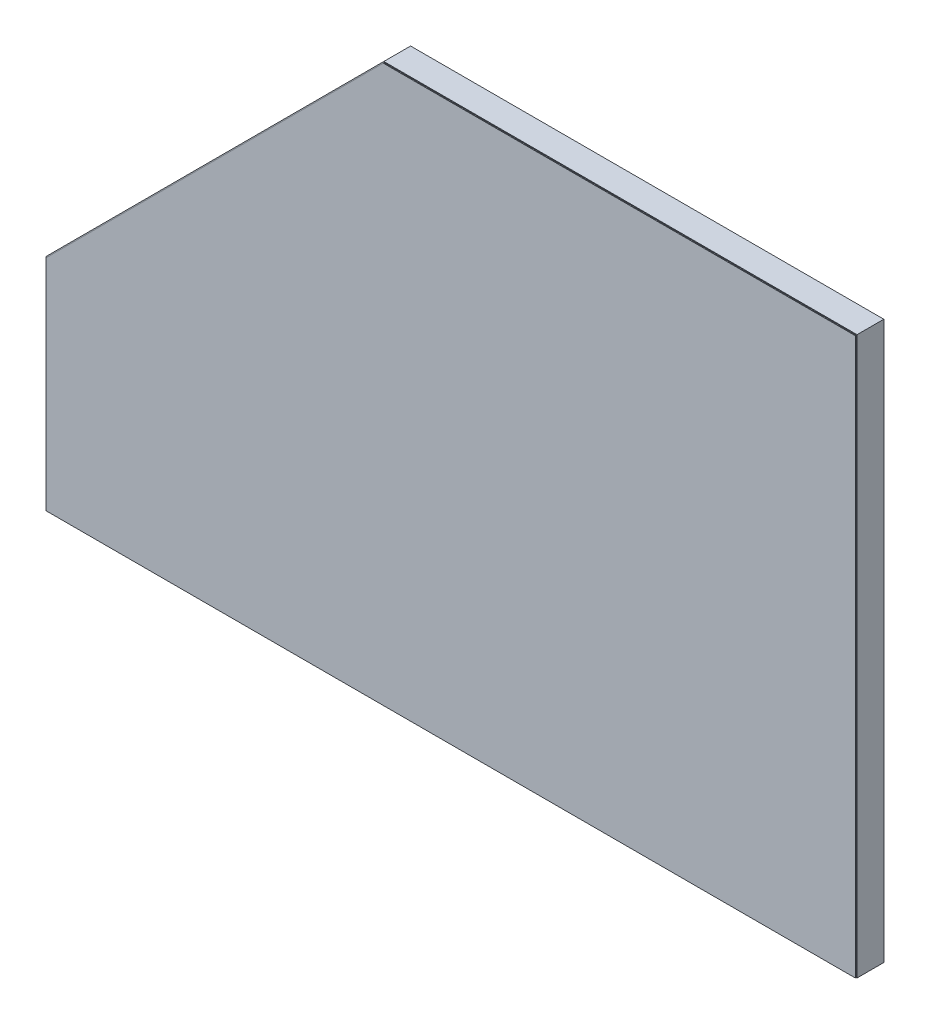
ISO-10303-21;
HEADER;
FILE_DESCRIPTION(('STEP AP214'),'2;1');
FILE_NAME('part.step','',(''),(''),'','','');
FILE_SCHEMA(('AUTOMOTIVE_DESIGN { 1 0 10303 214 1 1 1 1 }'));
ENDSEC;
DATA;
#1=APPLICATION_CONTEXT('core data for automotive mechanical design processes');
#2=APPLICATION_PROTOCOL_DEFINITION('international standard','automotive_design',2000,#1);
#3=PRODUCT_CONTEXT('',#1,'mechanical');
#4=PRODUCT('Part','Part','',(#3));
#5=PRODUCT_RELATED_PRODUCT_CATEGORY('part','',(#4));
#6=PRODUCT_DEFINITION_FORMATION('','',#4);
#7=PRODUCT_DEFINITION_CONTEXT('part definition',#1,'design');
#8=PRODUCT_DEFINITION('design','',#6,#7);
#9=PRODUCT_DEFINITION_SHAPE('','',#8);
#10=(LENGTH_UNIT() NAMED_UNIT(*) SI_UNIT(.MILLI.,.METRE.));
#11=(NAMED_UNIT(*) PLANE_ANGLE_UNIT() SI_UNIT($,.RADIAN.));
#12=(NAMED_UNIT(*) SI_UNIT($,.STERADIAN.) SOLID_ANGLE_UNIT());
#13=UNCERTAINTY_MEASURE_WITH_UNIT(LENGTH_MEASURE(1.E-05),#10,'distance_accuracy_value','');
#14=(GEOMETRIC_REPRESENTATION_CONTEXT(3) GLOBAL_UNCERTAINTY_ASSIGNED_CONTEXT((#13)) GLOBAL_UNIT_ASSIGNED_CONTEXT((#10,
#11,#12)) REPRESENTATION_CONTEXT('',''));
#15=CARTESIAN_POINT('',(0.,0.,0.));
#16=DIRECTION('',(0.,0.,1.));
#17=DIRECTION('',(1.,0.,0.));
#18=AXIS2_PLACEMENT_3D('',#15,#16,#17);
#19=CARTESIAN_POINT('',(0.,0.,-25.4));
#20=DIRECTION('',(-1.,0.,0.));
#21=DIRECTION('',(0.,-1.,0.));
#22=AXIS2_PLACEMENT_3D('',#19,#20,#21);
#23=PLANE('',#22);
#24=DIRECTION('',(0.,-1.,0.));
#25=VECTOR('',#24,1.);
#26=CARTESIAN_POINT('',(0.,0.,0.));
#27=LINE('',#26,#25);
#28=CARTESIAN_POINT('',(0.,208.,0.));
#29=VERTEX_POINT('',#28);
#30=CARTESIAN_POINT('',(0.,0.,0.));
#31=VERTEX_POINT('',#30);
#32=EDGE_CURVE('E159',#29,#31,#27,.T.);
#33=ORIENTED_EDGE('',*,*,#32,.T.);
#34=DIRECTION('',(0.,0.,1.));
#35=VECTOR('',#34,1.);
#36=CARTESIAN_POINT('',(0.,0.,-25.4));
#37=LINE('',#36,#35);
#38=CARTESIAN_POINT('',(0.,0.,-25.4));
#39=VERTEX_POINT('',#38);
#40=EDGE_CURVE('E12',#39,#31,#37,.T.);
#41=ORIENTED_EDGE('',*,*,#40,.F.);
#42=DIRECTION('',(0.,-1.,0.));
#43=VECTOR('',#42,1.);
#44=CARTESIAN_POINT('',(0.,0.,-25.4));
#45=LINE('',#44,#43);
#46=CARTESIAN_POINT('',(0.,208.,-25.4));
#47=VERTEX_POINT('',#46);
#48=EDGE_CURVE('E177',#47,#39,#45,.T.);
#49=ORIENTED_EDGE('',*,*,#48,.F.);
#50=DIRECTION('',(0.,0.,1.));
#51=VECTOR('',#50,1.);
#52=CARTESIAN_POINT('',(0.,208.,-25.4));
#53=LINE('',#52,#51);
#54=EDGE_CURVE('E155',#47,#29,#53,.T.);
#55=ORIENTED_EDGE('',*,*,#54,.T.);
#56=EDGE_LOOP('',(#33,#41,#49,#55));
#57=FACE_BOUND('',#56,.T.);
#58=ADVANCED_FACE('F51',(#57),#23,.F.);
#59=CARTESIAN_POINT('',(-0.83566,0.,-25.4));
#60=DIRECTION('',(0.,1.,0.));
#61=DIRECTION('',(0.,0.,1.));
#62=AXIS2_PLACEMENT_3D('',#59,#60,#61);
#63=PLANE('',#62);
#64=DIRECTION('',(-1.,0.,0.));
#65=VECTOR('',#64,1.);
#66=CARTESIAN_POINT('',(-0.83566,0.,0.));
#67=LINE('',#66,#65);
#68=CARTESIAN_POINT('',(-0.83566,0.,0.));
#69=VERTEX_POINT('',#68);
#70=EDGE_CURVE('E162',#31,#69,#67,.T.);
#71=ORIENTED_EDGE('',*,*,#70,.T.);
#72=DIRECTION('',(0.,0.,1.));
#73=VECTOR('',#72,1.);
#74=CARTESIAN_POINT('',(-0.83566,0.,-25.4));
#75=LINE('',#74,#73);
#76=CARTESIAN_POINT('',(-0.83566,0.,-25.4));
#77=VERTEX_POINT('',#76);
#78=EDGE_CURVE('E59',#77,#69,#75,.T.);
#79=ORIENTED_EDGE('',*,*,#78,.F.);
#80=DIRECTION('',(-1.,0.,0.));
#81=VECTOR('',#80,1.);
#82=CARTESIAN_POINT('',(-0.83566,0.,-25.4));
#83=LINE('',#82,#81);
#84=EDGE_CURVE('E116',#39,#77,#83,.T.);
#85=ORIENTED_EDGE('',*,*,#84,.F.);
#86=ORIENTED_EDGE('',*,*,#40,.T.);
#87=EDGE_LOOP('',(#71,#79,#85,#86));
#88=FACE_BOUND('',#87,.T.);
#89=ADVANCED_FACE('F226',(#88),#63,.F.);
#90=CARTESIAN_POINT('',(-0.83566,0.,-25.4));
#91=DIRECTION('',(1.,0.,0.));
#92=DIRECTION('',(0.,1.,0.));
#93=AXIS2_PLACEMENT_3D('',#90,#91,#92);
#94=PLANE('',#93);
#95=DIRECTION('',(0.,1.,0.));
#96=VECTOR('',#95,1.);
#97=CARTESIAN_POINT('',(-0.83566,0.,0.));
#98=LINE('',#97,#96);
#99=CARTESIAN_POINT('',(-0.83566,208.346141705533,0.));
#100=VERTEX_POINT('',#99);
#101=EDGE_CURVE('E164',#69,#100,#98,.T.);
#102=ORIENTED_EDGE('',*,*,#101,.T.);
#103=DIRECTION('',(0.,0.,1.));
#104=VECTOR('',#103,1.);
#105=CARTESIAN_POINT('',(-0.83566,208.346141705533,-25.4));
#106=LINE('',#105,#104);
#107=CARTESIAN_POINT('',(-0.83566,208.346141705533,-25.4));
#108=VERTEX_POINT('',#107);
#109=EDGE_CURVE('E190',#108,#100,#106,.T.);
#110=ORIENTED_EDGE('',*,*,#109,.F.);
#111=DIRECTION('',(0.,1.,0.));
#112=VECTOR('',#111,1.);
#113=CARTESIAN_POINT('',(-0.83566,0.,-25.4));
#114=LINE('',#113,#112);
#115=EDGE_CURVE('E198',#77,#108,#114,.T.);
#116=ORIENTED_EDGE('',*,*,#115,.F.);
#117=ORIENTED_EDGE('',*,*,#78,.T.);
#118=EDGE_LOOP('',(#102,#110,#116,#117));
#119=FACE_BOUND('',#118,.T.);
#120=ADVANCED_FACE('F196',(#119),#94,.F.);
#121=CARTESIAN_POINT('',(-0.83566,208.346141705533,-25.4));
#122=DIRECTION('',(0.707106781186548,-0.707106781186547,0.));
#123=DIRECTION('',(0.707106781186547,0.707106781186548,0.));
#124=AXIS2_PLACEMENT_3D('',#121,#122,#123);
#125=PLANE('',#124);
#126=DIRECTION('',(0.707106781186547,0.707106781186548,0.));
#127=VECTOR('',#126,1.);
#128=CARTESIAN_POINT('',(-0.83566,208.346141705533,0.));
#129=LINE('',#128,#127);
#130=CARTESIAN_POINT('',(319.653858294467,528.83566,0.));
#131=VERTEX_POINT('',#130);
#132=EDGE_CURVE('E166',#100,#131,#129,.T.);
#133=ORIENTED_EDGE('',*,*,#132,.T.);
#134=DIRECTION('',(0.,0.,1.));
#135=VECTOR('',#134,1.);
#136=CARTESIAN_POINT('',(319.653858294467,528.83566,-25.4));
#137=LINE('',#136,#135);
#138=CARTESIAN_POINT('',(319.653858294467,528.83566,-25.4));
#139=VERTEX_POINT('',#138);
#140=EDGE_CURVE('E187',#139,#131,#137,.T.);
#141=ORIENTED_EDGE('',*,*,#140,.F.);
#142=DIRECTION('',(0.707106781186547,0.707106781186548,0.));
#143=VECTOR('',#142,1.);
#144=CARTESIAN_POINT('',(-0.83566,208.346141705533,-25.4));
#145=LINE('',#144,#143);
#146=EDGE_CURVE('E216',#108,#139,#145,.T.);
#147=ORIENTED_EDGE('',*,*,#146,.F.);
#148=ORIENTED_EDGE('',*,*,#109,.T.);
#149=EDGE_LOOP('',(#133,#141,#147,#148));
#150=FACE_BOUND('',#149,.T.);
#151=ADVANCED_FACE('F207',(#150),#125,.F.);
#152=CARTESIAN_POINT('',(319.653858294467,528.83566,-25.4));
#153=DIRECTION('',(0.,-1.,0.));
#154=DIRECTION('',(1.,0.,0.));
#155=AXIS2_PLACEMENT_3D('',#152,#153,#154);
#156=PLANE('',#155);
#157=DIRECTION('',(1.,0.,0.));
#158=VECTOR('',#157,1.);
#159=CARTESIAN_POINT('',(319.653858294467,528.83566,0.));
#160=LINE('',#159,#158);
#161=CARTESIAN_POINT('',(768.83566,528.83566,0.));
#162=VERTEX_POINT('',#161);
#163=EDGE_CURVE('E168',#131,#162,#160,.T.);
#164=ORIENTED_EDGE('',*,*,#163,.T.);
#165=DIRECTION('',(0.,0.,1.));
#166=VECTOR('',#165,1.);
#167=CARTESIAN_POINT('',(768.83566,528.83566,-25.4));
#168=LINE('',#167,#166);
#169=CARTESIAN_POINT('',(768.83566,528.83566,-25.4));
#170=VERTEX_POINT('',#169);
#171=EDGE_CURVE('E184',#170,#162,#168,.T.);
#172=ORIENTED_EDGE('',*,*,#171,.F.);
#173=DIRECTION('',(1.,0.,0.));
#174=VECTOR('',#173,1.);
#175=CARTESIAN_POINT('',(319.653858294467,528.83566,-25.4));
#176=LINE('',#175,#174);
#177=EDGE_CURVE('E213',#139,#170,#176,.T.);
#178=ORIENTED_EDGE('',*,*,#177,.F.);
#179=ORIENTED_EDGE('',*,*,#140,.T.);
#180=EDGE_LOOP('',(#164,#172,#178,#179));
#181=FACE_BOUND('',#180,.T.);
#182=ADVANCED_FACE('F211',(#181),#156,.F.);
#183=CARTESIAN_POINT('',(768.83566,528.83566,-25.4));
#184=DIRECTION('',(-1.,0.,0.));
#185=DIRECTION('',(0.,-1.,0.));
#186=AXIS2_PLACEMENT_3D('',#183,#184,#185);
#187=PLANE('',#186);
#188=DIRECTION('',(0.,-1.,0.));
#189=VECTOR('',#188,1.);
#190=CARTESIAN_POINT('',(768.83566,528.83566,0.));
#191=LINE('',#190,#189);
#192=CARTESIAN_POINT('',(768.83566,0.,0.));
#193=VERTEX_POINT('',#192);
#194=EDGE_CURVE('E170',#162,#193,#191,.T.);
#195=ORIENTED_EDGE('',*,*,#194,.T.);
#196=DIRECTION('',(0.,0.,1.));
#197=VECTOR('',#196,1.);
#198=CARTESIAN_POINT('',(768.83566,0.,-25.4));
#199=LINE('',#198,#197);
#200=CARTESIAN_POINT('',(768.83566,0.,-25.4));
#201=VERTEX_POINT('',#200);
#202=EDGE_CURVE('E181',#201,#193,#199,.T.);
#203=ORIENTED_EDGE('',*,*,#202,.F.);
#204=DIRECTION('',(0.,-1.,0.));
#205=VECTOR('',#204,1.);
#206=CARTESIAN_POINT('',(768.83566,528.83566,-25.4));
#207=LINE('',#206,#205);
#208=EDGE_CURVE('E215',#170,#201,#207,.T.);
#209=ORIENTED_EDGE('',*,*,#208,.F.);
#210=ORIENTED_EDGE('',*,*,#171,.T.);
#211=EDGE_LOOP('',(#195,#203,#209,#210));
#212=FACE_BOUND('',#211,.T.);
#213=ADVANCED_FACE('F238',(#212),#187,.F.);
#214=CARTESIAN_POINT('',(768.83566,0.,-25.4));
#215=DIRECTION('',(0.,1.,0.));
#216=DIRECTION('',(-1.,0.,0.));
#217=AXIS2_PLACEMENT_3D('',#214,#215,#216);
#218=PLANE('',#217);
#219=DIRECTION('',(-1.,0.,0.));
#220=VECTOR('',#219,1.);
#221=CARTESIAN_POINT('',(768.83566,0.,0.));
#222=LINE('',#221,#220);
#223=CARTESIAN_POINT('',(768.,0.,0.));
#224=VERTEX_POINT('',#223);
#225=EDGE_CURVE('E172',#193,#224,#222,.T.);
#226=ORIENTED_EDGE('',*,*,#225,.T.);
#227=DIRECTION('',(0.,0.,1.));
#228=VECTOR('',#227,1.);
#229=CARTESIAN_POINT('',(768.,0.,-25.4));
#230=LINE('',#229,#228);
#231=CARTESIAN_POINT('',(768.,0.,-25.4));
#232=VERTEX_POINT('',#231);
#233=EDGE_CURVE('E150',#232,#224,#230,.T.);
#234=ORIENTED_EDGE('',*,*,#233,.F.);
#235=DIRECTION('',(-1.,0.,0.));
#236=VECTOR('',#235,1.);
#237=CARTESIAN_POINT('',(768.83566,0.,-25.4));
#238=LINE('',#237,#236);
#239=EDGE_CURVE('E141',#201,#232,#238,.T.);
#240=ORIENTED_EDGE('',*,*,#239,.F.);
#241=ORIENTED_EDGE('',*,*,#202,.T.);
#242=EDGE_LOOP('',(#226,#234,#240,#241));
#243=FACE_BOUND('',#242,.T.);
#244=ADVANCED_FACE('F241',(#243),#218,.F.);
#245=CARTESIAN_POINT('',(768.,528.,-25.4));
#246=DIRECTION('',(1.,0.,0.));
#247=DIRECTION('',(0.,0.,-1.));
#248=AXIS2_PLACEMENT_3D('',#245,#246,#247);
#249=PLANE('',#248);
#250=DIRECTION('',(0.,1.,0.));
#251=VECTOR('',#250,1.);
#252=CARTESIAN_POINT('',(768.,528.,0.));
#253=LINE('',#252,#251);
#254=CARTESIAN_POINT('',(768.,528.,0.));
#255=VERTEX_POINT('',#254);
#256=EDGE_CURVE('E149',#224,#255,#253,.T.);
#257=ORIENTED_EDGE('',*,*,#256,.T.);
#258=DIRECTION('',(0.,0.,1.));
#259=VECTOR('',#258,1.);
#260=CARTESIAN_POINT('',(768.,528.,-25.4));
#261=LINE('',#260,#259);
#262=CARTESIAN_POINT('',(768.,528.,-25.4));
#263=VERTEX_POINT('',#262);
#264=EDGE_CURVE('E146',#263,#255,#261,.T.);
#265=ORIENTED_EDGE('',*,*,#264,.F.);
#266=DIRECTION('',(0.,1.,0.));
#267=VECTOR('',#266,1.);
#268=CARTESIAN_POINT('',(768.,528.,-25.4));
#269=LINE('',#268,#267);
#270=EDGE_CURVE('E135',#232,#263,#269,.T.);
#271=ORIENTED_EDGE('',*,*,#270,.F.);
#272=ORIENTED_EDGE('',*,*,#233,.T.);
#273=EDGE_LOOP('',(#257,#265,#271,#272));
#274=FACE_BOUND('',#273,.T.);
#275=ADVANCED_FACE('F147',(#274),#249,.F.);
#276=CARTESIAN_POINT('',(320.,528.,-25.4));
#277=DIRECTION('',(0.,1.,0.));
#278=DIRECTION('',(-1.,0.,0.));
#279=AXIS2_PLACEMENT_3D('',#276,#277,#278);
#280=PLANE('',#279);
#281=DIRECTION('',(-1.,0.,0.));
#282=VECTOR('',#281,1.);
#283=CARTESIAN_POINT('',(320.,528.,0.));
#284=LINE('',#283,#282);
#285=CARTESIAN_POINT('',(320.,528.,0.));
#286=VERTEX_POINT('',#285);
#287=EDGE_CURVE('E102',#255,#286,#284,.T.);
#288=ORIENTED_EDGE('',*,*,#287,.T.);
#289=DIRECTION('',(0.,0.,1.));
#290=VECTOR('',#289,1.);
#291=CARTESIAN_POINT('',(320.,528.,-25.4));
#292=LINE('',#291,#290);
#293=CARTESIAN_POINT('',(320.,528.,-25.4));
#294=VERTEX_POINT('',#293);
#295=EDGE_CURVE('E151',#294,#286,#292,.T.);
#296=ORIENTED_EDGE('',*,*,#295,.F.);
#297=DIRECTION('',(-1.,0.,0.));
#298=VECTOR('',#297,1.);
#299=CARTESIAN_POINT('',(320.,528.,-25.4));
#300=LINE('',#299,#298);
#301=EDGE_CURVE('E139',#263,#294,#300,.T.);
#302=ORIENTED_EDGE('',*,*,#301,.F.);
#303=ORIENTED_EDGE('',*,*,#264,.T.);
#304=EDGE_LOOP('',(#288,#296,#302,#303));
#305=FACE_BOUND('',#304,.T.);
#306=ADVANCED_FACE('F153',(#305),#280,.F.);
#307=CARTESIAN_POINT('',(0.,208.,-25.4));
#308=DIRECTION('',(-0.707106781186548,0.707106781186547,0.));
#309=DIRECTION('',(-0.707106781186547,-0.707106781186548,0.));
#310=AXIS2_PLACEMENT_3D('',#307,#308,#309);
#311=PLANE('',#310);
#312=DIRECTION('',(-0.707106781186547,-0.707106781186548,0.));
#313=VECTOR('',#312,1.);
#314=CARTESIAN_POINT('',(0.,208.,0.));
#315=LINE('',#314,#313);
#316=EDGE_CURVE('E108',#286,#29,#315,.T.);
#317=ORIENTED_EDGE('',*,*,#316,.T.);
#318=ORIENTED_EDGE('',*,*,#54,.F.);
#319=DIRECTION('',(-0.707106781186547,-0.707106781186548,0.));
#320=VECTOR('',#319,1.);
#321=CARTESIAN_POINT('',(0.,208.,-25.4));
#322=LINE('',#321,#320);
#323=EDGE_CURVE('E67',#294,#47,#322,.T.);
#324=ORIENTED_EDGE('',*,*,#323,.F.);
#325=ORIENTED_EDGE('',*,*,#295,.T.);
#326=EDGE_LOOP('',(#317,#318,#324,#325));
#327=FACE_BOUND('',#326,.T.);
#328=ADVANCED_FACE('F250',(#327),#311,.F.);
#329=CARTESIAN_POINT('',(0.,0.,-25.4));
#330=DIRECTION('',(0.,0.,-1.));
#331=DIRECTION('',(-1.,0.,0.));
#332=AXIS2_PLACEMENT_3D('',#329,#330,#331);
#333=PLANE('',#332);
#334=ORIENTED_EDGE('',*,*,#48,.T.);
#335=ORIENTED_EDGE('',*,*,#84,.T.);
#336=ORIENTED_EDGE('',*,*,#115,.T.);
#337=ORIENTED_EDGE('',*,*,#146,.T.);
#338=ORIENTED_EDGE('',*,*,#177,.T.);
#339=ORIENTED_EDGE('',*,*,#208,.T.);
#340=ORIENTED_EDGE('',*,*,#239,.T.);
#341=ORIENTED_EDGE('',*,*,#270,.T.);
#342=ORIENTED_EDGE('',*,*,#301,.T.);
#343=ORIENTED_EDGE('',*,*,#323,.T.);
#344=EDGE_LOOP('',(#334,#335,#336,#337,#338,#339,#340,#341,#342,#343));
#345=FACE_BOUND('',#344,.T.);
#346=ADVANCED_FACE('F137',(#345),#333,.T.);
#347=CARTESIAN_POINT('',(0.,0.,0.));
#348=DIRECTION('',(0.,0.,-1.));
#349=DIRECTION('',(-1.,0.,0.));
#350=AXIS2_PLACEMENT_3D('',#347,#348,#349);
#351=PLANE('',#350);
#352=ORIENTED_EDGE('',*,*,#32,.F.);
#353=ORIENTED_EDGE('',*,*,#316,.F.);
#354=ORIENTED_EDGE('',*,*,#287,.F.);
#355=ORIENTED_EDGE('',*,*,#256,.F.);
#356=ORIENTED_EDGE('',*,*,#225,.F.);
#357=ORIENTED_EDGE('',*,*,#194,.F.);
#358=ORIENTED_EDGE('',*,*,#163,.F.);
#359=ORIENTED_EDGE('',*,*,#132,.F.);
#360=ORIENTED_EDGE('',*,*,#101,.F.);
#361=ORIENTED_EDGE('',*,*,#70,.F.);
#362=EDGE_LOOP('',(#352,#353,#354,#355,#356,#357,#358,#359,#360,#361));
#363=FACE_BOUND('',#362,.T.);
#364=ADVANCED_FACE('F202',(#363),#351,.F.);
#365=CLOSED_SHELL('',(#58,#89,#120,#151,#182,#213,#244,#275,#306,#328,#346,#364));
#366=MANIFOLD_SOLID_BREP('B2',#365);
#367=CARTESIAN_POINT('',(0.,208.,0.83566));
#368=DIRECTION('',(1.,0.,0.));
#369=DIRECTION('',(0.,1.,0.));
#370=AXIS2_PLACEMENT_3D('',#367,#368,#369);
#371=PLANE('',#370);
#372=DIRECTION('',(0.,-1.,0.));
#373=VECTOR('',#372,1.);
#374=CARTESIAN_POINT('',(0.,208.,0.));
#375=LINE('',#374,#373);
#376=CARTESIAN_POINT('',(0.,208.,0.));
#377=VERTEX_POINT('',#376);
#378=CARTESIAN_POINT('',(0.,0.,0.));
#379=VERTEX_POINT('',#378);
#380=EDGE_CURVE('E429',#377,#379,#375,.T.);
#381=ORIENTED_EDGE('',*,*,#380,.T.);
#382=DIRECTION('',(0.,0.,-1.));
#383=VECTOR('',#382,1.);
#384=CARTESIAN_POINT('',(0.,0.,0.83566));
#385=LINE('',#384,#383);
#386=CARTESIAN_POINT('',(0.,0.,0.83566));
#387=VERTEX_POINT('',#386);
#388=EDGE_CURVE('E49',#387,#379,#385,.T.);
#389=ORIENTED_EDGE('',*,*,#388,.F.);
#390=DIRECTION('',(0.,-1.,0.));
#391=VECTOR('',#390,1.);
#392=CARTESIAN_POINT('',(0.,208.,0.83566));
#393=LINE('',#392,#391);
#394=CARTESIAN_POINT('',(0.,208.,0.83566));
#395=VERTEX_POINT('',#394);
#396=EDGE_CURVE('E437',#395,#387,#393,.T.);
#397=ORIENTED_EDGE('',*,*,#396,.F.);
#398=DIRECTION('',(0.,0.,-1.));
#399=VECTOR('',#398,1.);
#400=CARTESIAN_POINT('',(0.,208.,0.83566));
#401=LINE('',#400,#399);
#402=EDGE_CURVE('E425',#395,#377,#401,.T.);
#403=ORIENTED_EDGE('',*,*,#402,.T.);
#404=EDGE_LOOP('',(#381,#389,#397,#403));
#405=FACE_BOUND('',#404,.T.);
#406=ADVANCED_FACE('F355',(#405),#371,.F.);
#407=CARTESIAN_POINT('',(0.,0.,0.83566));
#408=DIRECTION('',(0.,1.,0.));
#409=DIRECTION('',(0.,0.,1.));
#410=AXIS2_PLACEMENT_3D('',#407,#408,#409);
#411=PLANE('',#410);
#412=DIRECTION('',(1.,0.,0.));
#413=VECTOR('',#412,1.);
#414=CARTESIAN_POINT('',(0.,0.,0.));
#415=LINE('',#414,#413);
#416=CARTESIAN_POINT('',(768.,0.,0.));
#417=VERTEX_POINT('',#416);
#418=EDGE_CURVE('E432',#379,#417,#415,.T.);
#419=ORIENTED_EDGE('',*,*,#418,.T.);
#420=DIRECTION('',(0.,0.,-1.));
#421=VECTOR('',#420,1.);
#422=CARTESIAN_POINT('',(768.,0.,0.83566));
#423=LINE('',#422,#421);
#424=CARTESIAN_POINT('',(768.,0.,0.83566));
#425=VERTEX_POINT('',#424);
#426=EDGE_CURVE('E363',#425,#417,#423,.T.);
#427=ORIENTED_EDGE('',*,*,#426,.F.);
#428=DIRECTION('',(1.,0.,0.));
#429=VECTOR('',#428,1.);
#430=CARTESIAN_POINT('',(0.,0.,0.83566));
#431=LINE('',#430,#429);
#432=EDGE_CURVE('E405',#387,#425,#431,.T.);
#433=ORIENTED_EDGE('',*,*,#432,.F.);
#434=ORIENTED_EDGE('',*,*,#388,.T.);
#435=EDGE_LOOP('',(#419,#427,#433,#434));
#436=FACE_BOUND('',#435,.T.);
#437=ADVANCED_FACE('F456',(#436),#411,.F.);
#438=CARTESIAN_POINT('',(768.,0.,0.83566));
#439=DIRECTION('',(-1.,0.,0.));
#440=DIRECTION('',(0.,0.,1.));
#441=AXIS2_PLACEMENT_3D('',#438,#439,#440);
#442=PLANE('',#441);
#443=DIRECTION('',(0.,1.,0.));
#444=VECTOR('',#443,1.);
#445=CARTESIAN_POINT('',(768.,0.,0.));
#446=LINE('',#445,#444);
#447=CARTESIAN_POINT('',(768.,528.,0.));
#448=VERTEX_POINT('',#447);
#449=EDGE_CURVE('E420',#417,#448,#446,.T.);
#450=ORIENTED_EDGE('',*,*,#449,.T.);
#451=DIRECTION('',(0.,0.,-1.));
#452=VECTOR('',#451,1.);
#453=CARTESIAN_POINT('',(768.,528.,0.83566));
#454=LINE('',#453,#452);
#455=CARTESIAN_POINT('',(768.,528.,0.83566));
#456=VERTEX_POINT('',#455);
#457=EDGE_CURVE('E417',#456,#448,#454,.T.);
#458=ORIENTED_EDGE('',*,*,#457,.F.);
#459=DIRECTION('',(0.,1.,0.));
#460=VECTOR('',#459,1.);
#461=CARTESIAN_POINT('',(768.,0.,0.83566));
#462=LINE('',#461,#460);
#463=EDGE_CURVE('E409',#425,#456,#462,.T.);
#464=ORIENTED_EDGE('',*,*,#463,.F.);
#465=ORIENTED_EDGE('',*,*,#426,.T.);
#466=EDGE_LOOP('',(#450,#458,#464,#465));
#467=FACE_BOUND('',#466,.T.);
#468=ADVANCED_FACE('F418',(#467),#442,.F.);
#469=CARTESIAN_POINT('',(768.,528.,0.83566));
#470=DIRECTION('',(0.,-1.,0.));
#471=DIRECTION('',(1.,0.,0.));
#472=AXIS2_PLACEMENT_3D('',#469,#470,#471);
#473=PLANE('',#472);
#474=DIRECTION('',(-1.,0.,0.));
#475=VECTOR('',#474,1.);
#476=CARTESIAN_POINT('',(768.,528.,0.));
#477=LINE('',#476,#475);
#478=CARTESIAN_POINT('',(320.,528.,0.));
#479=VERTEX_POINT('',#478);
#480=EDGE_CURVE('E391',#448,#479,#477,.T.);
#481=ORIENTED_EDGE('',*,*,#480,.T.);
#482=DIRECTION('',(0.,0.,-1.));
#483=VECTOR('',#482,1.);
#484=CARTESIAN_POINT('',(320.,528.,0.83566));
#485=LINE('',#484,#483);
#486=CARTESIAN_POINT('',(320.,528.,0.83566));
#487=VERTEX_POINT('',#486);
#488=EDGE_CURVE('E421',#487,#479,#485,.T.);
#489=ORIENTED_EDGE('',*,*,#488,.F.);
#490=DIRECTION('',(-1.,0.,0.));
#491=VECTOR('',#490,1.);
#492=CARTESIAN_POINT('',(768.,528.,0.83566));
#493=LINE('',#492,#491);
#494=EDGE_CURVE('E413',#456,#487,#493,.T.);
#495=ORIENTED_EDGE('',*,*,#494,.F.);
#496=ORIENTED_EDGE('',*,*,#457,.T.);
#497=EDGE_LOOP('',(#481,#489,#495,#496));
#498=FACE_BOUND('',#497,.T.);
#499=ADVANCED_FACE('F423',(#498),#473,.F.);
#500=CARTESIAN_POINT('',(320.,528.,0.83566));
#501=DIRECTION('',(0.707106781186548,-0.707106781186547,0.));
#502=DIRECTION('',(0.707106781186547,0.707106781186548,0.));
#503=AXIS2_PLACEMENT_3D('',#500,#501,#502);
#504=PLANE('',#503);
#505=DIRECTION('',(-0.707106781186547,-0.707106781186548,0.));
#506=VECTOR('',#505,1.);
#507=CARTESIAN_POINT('',(320.,528.,0.));
#508=LINE('',#507,#506);
#509=EDGE_CURVE('E397',#479,#377,#508,.T.);
#510=ORIENTED_EDGE('',*,*,#509,.T.);
#511=ORIENTED_EDGE('',*,*,#402,.F.);
#512=DIRECTION('',(-0.707106781186547,-0.707106781186548,0.));
#513=VECTOR('',#512,1.);
#514=CARTESIAN_POINT('',(320.,528.,0.83566));
#515=LINE('',#514,#513);
#516=EDGE_CURVE('E371',#487,#395,#515,.T.);
#517=ORIENTED_EDGE('',*,*,#516,.F.);
#518=ORIENTED_EDGE('',*,*,#488,.T.);
#519=EDGE_LOOP('',(#510,#511,#517,#518));
#520=FACE_BOUND('',#519,.T.);
#521=ADVANCED_FACE('F445',(#520),#504,.F.);
#522=CARTESIAN_POINT('',(0.,0.,0.83566));
#523=DIRECTION('',(0.,0.,1.));
#524=DIRECTION('',(1.,0.,0.));
#525=AXIS2_PLACEMENT_3D('',#522,#523,#524);
#526=PLANE('',#525);
#527=ORIENTED_EDGE('',*,*,#396,.T.);
#528=ORIENTED_EDGE('',*,*,#432,.T.);
#529=ORIENTED_EDGE('',*,*,#463,.T.);
#530=ORIENTED_EDGE('',*,*,#494,.T.);
#531=ORIENTED_EDGE('',*,*,#516,.T.);
#532=EDGE_LOOP('',(#527,#528,#529,#530,#531));
#533=FACE_BOUND('',#532,.T.);
#534=ADVANCED_FACE('F411',(#533),#526,.T.);
#535=CARTESIAN_POINT('',(0.,0.,0.));
#536=DIRECTION('',(0.,0.,1.));
#537=DIRECTION('',(1.,0.,0.));
#538=AXIS2_PLACEMENT_3D('',#535,#536,#537);
#539=PLANE('',#538);
#540=ORIENTED_EDGE('',*,*,#380,.F.);
#541=ORIENTED_EDGE('',*,*,#509,.F.);
#542=ORIENTED_EDGE('',*,*,#480,.F.);
#543=ORIENTED_EDGE('',*,*,#449,.F.);
#544=ORIENTED_EDGE('',*,*,#418,.F.);
#545=EDGE_LOOP('',(#540,#541,#542,#543,#544));
#546=FACE_BOUND('',#545,.T.);
#547=ADVANCED_FACE('F441',(#546),#539,.F.);
#548=CLOSED_SHELL('',(#406,#437,#468,#499,#521,#534,#547));
#549=MANIFOLD_SOLID_BREP('B6',#548);
#550=ADVANCED_BREP_SHAPE_REPRESENTATION('',(#18,#366,#549),#14);
#551=SHAPE_DEFINITION_REPRESENTATION(#9,#550);
ENDSEC;
END-ISO-10303-21;
